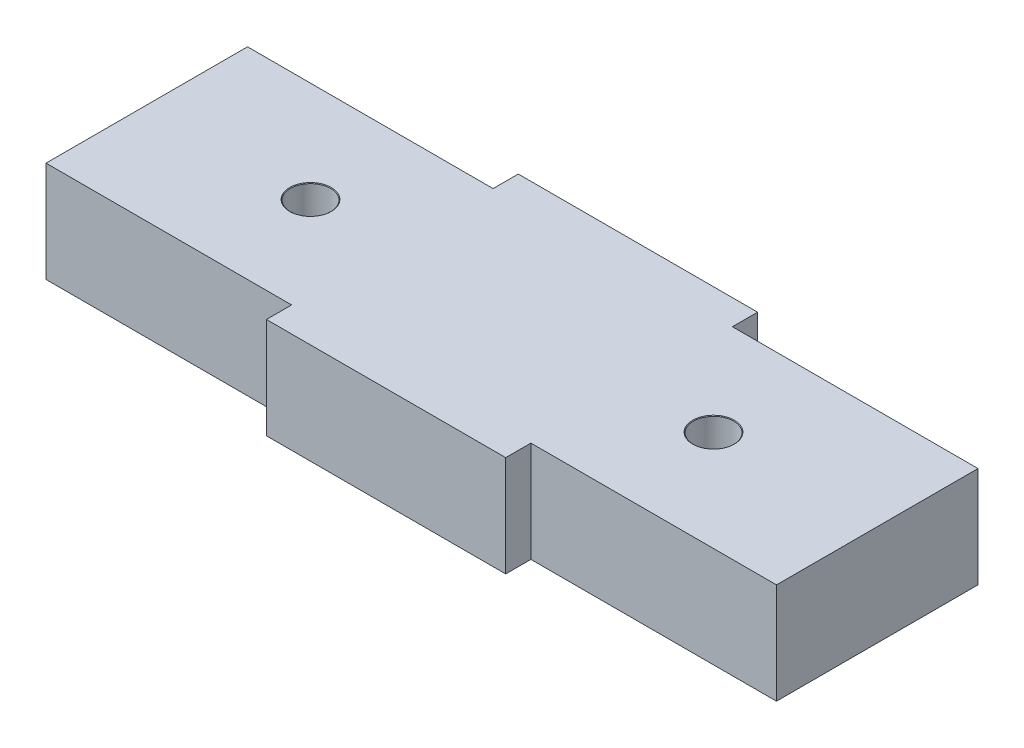
ISO-10303-21;
HEADER;
FILE_DESCRIPTION(('STEP AP214'),'2;1');
FILE_NAME('part.step','',(''),(''),'','','');
FILE_SCHEMA(('AUTOMOTIVE_DESIGN { 1 0 10303 214 1 1 1 1 }'));
ENDSEC;
DATA;
#1=APPLICATION_CONTEXT('core data for automotive mechanical design processes');
#2=APPLICATION_PROTOCOL_DEFINITION('international standard','automotive_design',2000,#1);
#3=PRODUCT_CONTEXT('',#1,'mechanical');
#4=PRODUCT('Part','Part','',(#3));
#5=PRODUCT_RELATED_PRODUCT_CATEGORY('part','',(#4));
#6=PRODUCT_DEFINITION_FORMATION('','',#4);
#7=PRODUCT_DEFINITION_CONTEXT('part definition',#1,'design');
#8=PRODUCT_DEFINITION('design','',#6,#7);
#9=PRODUCT_DEFINITION_SHAPE('','',#8);
#10=(LENGTH_UNIT() NAMED_UNIT(*) SI_UNIT(.MILLI.,.METRE.));
#11=(NAMED_UNIT(*) PLANE_ANGLE_UNIT() SI_UNIT($,.RADIAN.));
#12=(NAMED_UNIT(*) SI_UNIT($,.STERADIAN.) SOLID_ANGLE_UNIT());
#13=UNCERTAINTY_MEASURE_WITH_UNIT(LENGTH_MEASURE(1.E-05),#10,'distance_accuracy_value','');
#14=(GEOMETRIC_REPRESENTATION_CONTEXT(3) GLOBAL_UNCERTAINTY_ASSIGNED_CONTEXT((#13)) GLOBAL_UNIT_ASSIGNED_CONTEXT((#10,
#11,#12)) REPRESENTATION_CONTEXT('',''));
#15=CARTESIAN_POINT('',(0.,0.,0.));
#16=DIRECTION('',(0.,0.,1.));
#17=DIRECTION('',(1.,0.,0.));
#18=AXIS2_PLACEMENT_3D('',#15,#16,#17);
#19=CARTESIAN_POINT('',(0.,0.,0.));
#20=DIRECTION('',(0.,-1.,0.));
#21=DIRECTION('',(0.,0.,-1.));
#22=AXIS2_PLACEMENT_3D('',#19,#20,#21);
#23=PLANE('',#22);
#24=CARTESIAN_POINT('',(6.5,0.,-4.));
#25=DIRECTION('',(0.,1.,0.));
#26=DIRECTION('',(0.,0.,1.));
#27=AXIS2_PLACEMENT_3D('',#24,#25,#26);
#28=CIRCLE('',#27,0.799999999999999);
#29=CARTESIAN_POINT('',(6.5,0.,-3.2));
#30=VERTEX_POINT('',#29);
#31=EDGE_CURVE('E278',#30,#30,#28,.T.);
#32=ORIENTED_EDGE('',*,*,#31,.T.);
#33=EDGE_LOOP('',(#32));
#34=FACE_BOUND('',#33,.T.);
#35=DIRECTION('',(0.,0.,1.));
#36=VECTOR('',#35,1.);
#37=CARTESIAN_POINT('',(0.,0.,0.));
#38=LINE('',#37,#36);
#39=CARTESIAN_POINT('',(0.,0.,-8.));
#40=VERTEX_POINT('',#39);
#41=CARTESIAN_POINT('',(0.,0.,0.));
#42=VERTEX_POINT('',#41);
#43=EDGE_CURVE('E199',#40,#42,#38,.T.);
#44=ORIENTED_EDGE('',*,*,#43,.F.);
#45=DIRECTION('',(-1.,0.,0.));
#46=VECTOR('',#45,1.);
#47=CARTESIAN_POINT('',(0.,0.,-8.));
#48=LINE('',#47,#46);
#49=CARTESIAN_POINT('',(9.74999999999999,0.,-8.));
#50=VERTEX_POINT('',#49);
#51=EDGE_CURVE('E228',#50,#40,#48,.T.);
#52=ORIENTED_EDGE('',*,*,#51,.F.);
#53=DIRECTION('',(0.,0.,1.));
#54=VECTOR('',#53,1.);
#55=CARTESIAN_POINT('',(9.75,0.,-9.));
#56=LINE('',#55,#54);
#57=CARTESIAN_POINT('',(9.75,0.,-9.));
#58=VERTEX_POINT('',#57);
#59=EDGE_CURVE('E138',#58,#50,#56,.T.);
#60=ORIENTED_EDGE('',*,*,#59,.F.);
#61=DIRECTION('',(-1.,0.,0.));
#62=VECTOR('',#61,1.);
#63=CARTESIAN_POINT('',(19.25,0.,-9.));
#64=LINE('',#63,#62);
#65=CARTESIAN_POINT('',(19.25,0.,-9.));
#66=VERTEX_POINT('',#65);
#67=EDGE_CURVE('E130',#66,#58,#64,.T.);
#68=ORIENTED_EDGE('',*,*,#67,.F.);
#69=DIRECTION('',(0.,0.,1.));
#70=VECTOR('',#69,1.);
#71=CARTESIAN_POINT('',(19.25,0.,-9.));
#72=LINE('',#71,#70);
#73=CARTESIAN_POINT('',(19.25,0.,-8.));
#74=VERTEX_POINT('',#73);
#75=EDGE_CURVE('E136',#66,#74,#72,.T.);
#76=ORIENTED_EDGE('',*,*,#75,.T.);
#77=CARTESIAN_POINT('',(29.,0.,-8.));
#78=VERTEX_POINT('',#77);
#79=EDGE_CURVE('E205',#78,#74,#48,.T.);
#80=ORIENTED_EDGE('',*,*,#79,.F.);
#81=DIRECTION('',(0.,0.,-1.));
#82=VECTOR('',#81,1.);
#83=CARTESIAN_POINT('',(29.,0.,0.));
#84=LINE('',#83,#82);
#85=CARTESIAN_POINT('',(29.,0.,0.));
#86=VERTEX_POINT('',#85);
#87=EDGE_CURVE('E225',#86,#78,#84,.T.);
#88=ORIENTED_EDGE('',*,*,#87,.F.);
#89=DIRECTION('',(1.,0.,0.));
#90=VECTOR('',#89,1.);
#91=CARTESIAN_POINT('',(0.,0.,0.));
#92=LINE('',#91,#90);
#93=CARTESIAN_POINT('',(19.25,0.,0.));
#94=VERTEX_POINT('',#93);
#95=EDGE_CURVE('E221',#94,#86,#92,.T.);
#96=ORIENTED_EDGE('',*,*,#95,.F.);
#97=DIRECTION('',(0.,0.,-1.));
#98=VECTOR('',#97,1.);
#99=CARTESIAN_POINT('',(19.25,0.,1.));
#100=LINE('',#99,#98);
#101=CARTESIAN_POINT('',(19.25,0.,1.));
#102=VERTEX_POINT('',#101);
#103=EDGE_CURVE('E191',#102,#94,#100,.T.);
#104=ORIENTED_EDGE('',*,*,#103,.F.);
#105=DIRECTION('',(1.,0.,0.));
#106=VECTOR('',#105,1.);
#107=CARTESIAN_POINT('',(9.75,0.,1.));
#108=LINE('',#107,#106);
#109=CARTESIAN_POINT('',(9.75,0.,1.));
#110=VERTEX_POINT('',#109);
#111=EDGE_CURVE('E171',#110,#102,#108,.T.);
#112=ORIENTED_EDGE('',*,*,#111,.F.);
#113=DIRECTION('',(0.,0.,-1.));
#114=VECTOR('',#113,1.);
#115=CARTESIAN_POINT('',(9.75,0.,1.));
#116=LINE('',#115,#114);
#117=CARTESIAN_POINT('',(9.75,0.,0.));
#118=VERTEX_POINT('',#117);
#119=EDGE_CURVE('E195',#110,#118,#116,.T.);
#120=ORIENTED_EDGE('',*,*,#119,.T.);
#121=EDGE_CURVE('E222',#42,#118,#92,.T.);
#122=ORIENTED_EDGE('',*,*,#121,.F.);
#123=EDGE_LOOP('',(#44,#52,#60,#68,#76,#80,#88,#96,#104,#112,#120,#122));
#124=FACE_BOUND('',#123,.T.);
#125=CARTESIAN_POINT('',(22.5,0.,-4.));
#126=DIRECTION('',(0.,1.,0.));
#127=DIRECTION('',(0.,0.,1.));
#128=AXIS2_PLACEMENT_3D('',#125,#126,#127);
#129=CIRCLE('',#128,0.799999999999999);
#130=CARTESIAN_POINT('',(22.5,0.,-3.2));
#131=VERTEX_POINT('',#130);
#132=EDGE_CURVE('E263',#131,#131,#129,.T.);
#133=ORIENTED_EDGE('',*,*,#132,.T.);
#134=EDGE_LOOP('',(#133));
#135=FACE_BOUND('',#134,.T.);
#136=ADVANCED_FACE('F39',(#34,#124,#135),#23,.T.);
#137=CARTESIAN_POINT('',(0.,4.,0.));
#138=DIRECTION('',(0.,-1.,0.));
#139=DIRECTION('',(0.,0.,-1.));
#140=AXIS2_PLACEMENT_3D('',#137,#138,#139);
#141=PLANE('',#140);
#142=CARTESIAN_POINT('',(6.5,4.,-4.));
#143=DIRECTION('',(0.,1.,0.));
#144=DIRECTION('',(0.,0.,1.));
#145=AXIS2_PLACEMENT_3D('',#142,#143,#144);
#146=CIRCLE('',#145,0.825);
#147=CARTESIAN_POINT('',(6.5,4.,-3.175));
#148=VERTEX_POINT('',#147);
#149=EDGE_CURVE('E286',#148,#148,#146,.T.);
#150=ORIENTED_EDGE('',*,*,#149,.F.);
#151=EDGE_LOOP('',(#150));
#152=FACE_BOUND('',#151,.T.);
#153=DIRECTION('',(0.,0.,1.));
#154=VECTOR('',#153,1.);
#155=CARTESIAN_POINT('',(0.,4.,0.));
#156=LINE('',#155,#154);
#157=CARTESIAN_POINT('',(0.,4.,-8.));
#158=VERTEX_POINT('',#157);
#159=CARTESIAN_POINT('',(0.,4.,0.));
#160=VERTEX_POINT('',#159);
#161=EDGE_CURVE('E200',#158,#160,#156,.T.);
#162=ORIENTED_EDGE('',*,*,#161,.T.);
#163=DIRECTION('',(1.,0.,0.));
#164=VECTOR('',#163,1.);
#165=CARTESIAN_POINT('',(0.,4.,0.));
#166=LINE('',#165,#164);
#167=CARTESIAN_POINT('',(9.75,4.,0.));
#168=VERTEX_POINT('',#167);
#169=EDGE_CURVE('E206',#160,#168,#166,.T.);
#170=ORIENTED_EDGE('',*,*,#169,.T.);
#171=DIRECTION('',(0.,0.,-1.));
#172=VECTOR('',#171,1.);
#173=CARTESIAN_POINT('',(9.75,4.,1.));
#174=LINE('',#173,#172);
#175=CARTESIAN_POINT('',(9.75,4.,1.));
#176=VERTEX_POINT('',#175);
#177=EDGE_CURVE('E179',#176,#168,#174,.T.);
#178=ORIENTED_EDGE('',*,*,#177,.F.);
#179=DIRECTION('',(-1.,0.,0.));
#180=VECTOR('',#179,1.);
#181=CARTESIAN_POINT('',(9.75,4.,1.));
#182=LINE('',#181,#180);
#183=CARTESIAN_POINT('',(19.25,4.,1.));
#184=VERTEX_POINT('',#183);
#185=EDGE_CURVE('E177',#184,#176,#182,.T.);
#186=ORIENTED_EDGE('',*,*,#185,.F.);
#187=DIRECTION('',(0.,0.,-1.));
#188=VECTOR('',#187,1.);
#189=CARTESIAN_POINT('',(19.25,4.,1.));
#190=LINE('',#189,#188);
#191=CARTESIAN_POINT('',(19.25,4.,0.));
#192=VERTEX_POINT('',#191);
#193=EDGE_CURVE('E187',#184,#192,#190,.T.);
#194=ORIENTED_EDGE('',*,*,#193,.T.);
#195=CARTESIAN_POINT('',(29.,4.,0.));
#196=VERTEX_POINT('',#195);
#197=EDGE_CURVE('E204',#192,#196,#166,.T.);
#198=ORIENTED_EDGE('',*,*,#197,.T.);
#199=DIRECTION('',(0.,0.,-1.));
#200=VECTOR('',#199,1.);
#201=CARTESIAN_POINT('',(29.,4.,0.));
#202=LINE('',#201,#200);
#203=CARTESIAN_POINT('',(29.,4.,-8.));
#204=VERTEX_POINT('',#203);
#205=EDGE_CURVE('E210',#196,#204,#202,.T.);
#206=ORIENTED_EDGE('',*,*,#205,.T.);
#207=DIRECTION('',(-1.,0.,0.));
#208=VECTOR('',#207,1.);
#209=CARTESIAN_POINT('',(0.,4.,-8.));
#210=LINE('',#209,#208);
#211=CARTESIAN_POINT('',(19.25,4.,-8.));
#212=VERTEX_POINT('',#211);
#213=EDGE_CURVE('E214',#204,#212,#210,.T.);
#214=ORIENTED_EDGE('',*,*,#213,.T.);
#215=DIRECTION('',(0.,0.,1.));
#216=VECTOR('',#215,1.);
#217=CARTESIAN_POINT('',(19.25,4.,-9.));
#218=LINE('',#217,#216);
#219=CARTESIAN_POINT('',(19.25,4.,-9.));
#220=VERTEX_POINT('',#219);
#221=EDGE_CURVE('E252',#220,#212,#218,.T.);
#222=ORIENTED_EDGE('',*,*,#221,.F.);
#223=DIRECTION('',(1.,0.,0.));
#224=VECTOR('',#223,1.);
#225=CARTESIAN_POINT('',(19.25,4.,-9.));
#226=LINE('',#225,#224);
#227=CARTESIAN_POINT('',(9.75,4.,-9.));
#228=VERTEX_POINT('',#227);
#229=EDGE_CURVE('E148',#228,#220,#226,.T.);
#230=ORIENTED_EDGE('',*,*,#229,.F.);
#231=DIRECTION('',(0.,0.,1.));
#232=VECTOR('',#231,1.);
#233=CARTESIAN_POINT('',(9.75,4.,-9.));
#234=LINE('',#233,#232);
#235=CARTESIAN_POINT('',(9.75,4.,-8.));
#236=VERTEX_POINT('',#235);
#237=EDGE_CURVE('E163',#228,#236,#234,.T.);
#238=ORIENTED_EDGE('',*,*,#237,.T.);
#239=EDGE_CURVE('E213',#236,#158,#210,.T.);
#240=ORIENTED_EDGE('',*,*,#239,.T.);
#241=EDGE_LOOP('',(#162,#170,#178,#186,#194,#198,#206,#214,#222,#230,#238,#240));
#242=FACE_BOUND('',#241,.T.);
#243=CARTESIAN_POINT('',(22.5,4.,-4.));
#244=DIRECTION('',(0.,1.,0.));
#245=DIRECTION('',(0.,0.,1.));
#246=AXIS2_PLACEMENT_3D('',#243,#244,#245);
#247=CIRCLE('',#246,0.824999999999999);
#248=CARTESIAN_POINT('',(22.5,4.,-3.175));
#249=VERTEX_POINT('',#248);
#250=EDGE_CURVE('E274',#249,#249,#247,.T.);
#251=ORIENTED_EDGE('',*,*,#250,.F.);
#252=EDGE_LOOP('',(#251));
#253=FACE_BOUND('',#252,.T.);
#254=ADVANCED_FACE('F250',(#152,#242,#253),#141,.F.);
#255=CARTESIAN_POINT('',(0.,4.,-8.));
#256=DIRECTION('',(0.,0.,1.));
#257=DIRECTION('',(1.,0.,0.));
#258=AXIS2_PLACEMENT_3D('',#255,#256,#257);
#259=PLANE('',#258);
#260=DIRECTION('',(0.,-1.,0.));
#261=VECTOR('',#260,1.);
#262=CARTESIAN_POINT('',(19.25,0.,-8.));
#263=LINE('',#262,#261);
#264=EDGE_CURVE('E55',#212,#74,#263,.T.);
#265=ORIENTED_EDGE('',*,*,#264,.F.);
#266=ORIENTED_EDGE('',*,*,#213,.F.);
#267=DIRECTION('',(0.,-1.,0.));
#268=VECTOR('',#267,1.);
#269=CARTESIAN_POINT('',(29.,4.,-8.));
#270=LINE('',#269,#268);
#271=EDGE_CURVE('E234',#204,#78,#270,.T.);
#272=ORIENTED_EDGE('',*,*,#271,.T.);
#273=ORIENTED_EDGE('',*,*,#79,.T.);
#274=EDGE_LOOP('',(#265,#266,#272,#273));
#275=FACE_BOUND('',#274,.T.);
#276=ADVANCED_FACE('F248',(#275),#259,.F.);
#277=DIRECTION('',(0.,1.,0.));
#278=VECTOR('',#277,1.);
#279=CARTESIAN_POINT('',(9.75,0.,-8.));
#280=LINE('',#279,#278);
#281=EDGE_CURVE('E63',#50,#236,#280,.T.);
#282=ORIENTED_EDGE('',*,*,#281,.F.);
#283=ORIENTED_EDGE('',*,*,#51,.T.);
#284=DIRECTION('',(0.,-1.,0.));
#285=VECTOR('',#284,1.);
#286=CARTESIAN_POINT('',(0.,4.,-8.));
#287=LINE('',#286,#285);
#288=EDGE_CURVE('E217',#158,#40,#287,.T.);
#289=ORIENTED_EDGE('',*,*,#288,.F.);
#290=ORIENTED_EDGE('',*,*,#239,.F.);
#291=EDGE_LOOP('',(#282,#283,#289,#290));
#292=FACE_BOUND('',#291,.T.);
#293=ADVANCED_FACE('F299',(#292),#259,.F.);
#294=CARTESIAN_POINT('',(0.,4.,0.));
#295=DIRECTION('',(0.,0.,-1.));
#296=DIRECTION('',(-1.,0.,0.));
#297=AXIS2_PLACEMENT_3D('',#294,#295,#296);
#298=PLANE('',#297);
#299=DIRECTION('',(0.,-1.,0.));
#300=VECTOR('',#299,1.);
#301=CARTESIAN_POINT('',(9.75,0.,0.));
#302=LINE('',#301,#300);
#303=EDGE_CURVE('E156',#168,#118,#302,.T.);
#304=ORIENTED_EDGE('',*,*,#303,.F.);
#305=ORIENTED_EDGE('',*,*,#169,.F.);
#306=DIRECTION('',(0.,-1.,0.));
#307=VECTOR('',#306,1.);
#308=CARTESIAN_POINT('',(0.,4.,0.));
#309=LINE('',#308,#307);
#310=EDGE_CURVE('E11',#160,#42,#309,.T.);
#311=ORIENTED_EDGE('',*,*,#310,.T.);
#312=ORIENTED_EDGE('',*,*,#121,.T.);
#313=EDGE_LOOP('',(#304,#305,#311,#312));
#314=FACE_BOUND('',#313,.T.);
#315=ADVANCED_FACE('F308',(#314),#298,.F.);
#316=DIRECTION('',(0.,1.,0.));
#317=VECTOR('',#316,1.);
#318=CARTESIAN_POINT('',(19.25,0.,0.));
#319=LINE('',#318,#317);
#320=EDGE_CURVE('E161',#94,#192,#319,.T.);
#321=ORIENTED_EDGE('',*,*,#320,.F.);
#322=ORIENTED_EDGE('',*,*,#95,.T.);
#323=DIRECTION('',(0.,-1.,0.));
#324=VECTOR('',#323,1.);
#325=CARTESIAN_POINT('',(29.,4.,0.));
#326=LINE('',#325,#324);
#327=EDGE_CURVE('E48',#196,#86,#326,.T.);
#328=ORIENTED_EDGE('',*,*,#327,.F.);
#329=ORIENTED_EDGE('',*,*,#197,.F.);
#330=EDGE_LOOP('',(#321,#322,#328,#329));
#331=FACE_BOUND('',#330,.T.);
#332=ADVANCED_FACE('F310',(#331),#298,.F.);
#333=CARTESIAN_POINT('',(0.,4.,0.));
#334=DIRECTION('',(1.,0.,0.));
#335=DIRECTION('',(0.,0.,-1.));
#336=AXIS2_PLACEMENT_3D('',#333,#334,#335);
#337=PLANE('',#336);
#338=ORIENTED_EDGE('',*,*,#43,.T.);
#339=ORIENTED_EDGE('',*,*,#310,.F.);
#340=ORIENTED_EDGE('',*,*,#161,.F.);
#341=ORIENTED_EDGE('',*,*,#288,.T.);
#342=EDGE_LOOP('',(#338,#339,#340,#341));
#343=FACE_BOUND('',#342,.T.);
#344=ADVANCED_FACE('F41',(#343),#337,.F.);
#345=CARTESIAN_POINT('',(29.,4.,0.));
#346=DIRECTION('',(-1.,0.,0.));
#347=DIRECTION('',(0.,0.,1.));
#348=AXIS2_PLACEMENT_3D('',#345,#346,#347);
#349=PLANE('',#348);
#350=ORIENTED_EDGE('',*,*,#87,.T.);
#351=ORIENTED_EDGE('',*,*,#271,.F.);
#352=ORIENTED_EDGE('',*,*,#205,.F.);
#353=ORIENTED_EDGE('',*,*,#327,.T.);
#354=EDGE_LOOP('',(#350,#351,#352,#353));
#355=FACE_BOUND('',#354,.T.);
#356=ADVANCED_FACE('F243',(#355),#349,.F.);
#357=CARTESIAN_POINT('',(9.75,0.,1.));
#358=DIRECTION('',(1.,0.,0.));
#359=DIRECTION('',(0.,0.,-1.));
#360=AXIS2_PLACEMENT_3D('',#357,#358,#359);
#361=PLANE('',#360);
#362=ORIENTED_EDGE('',*,*,#303,.T.);
#363=ORIENTED_EDGE('',*,*,#119,.F.);
#364=DIRECTION('',(0.,-1.,0.));
#365=VECTOR('',#364,1.);
#366=CARTESIAN_POINT('',(9.75,0.,1.));
#367=LINE('',#366,#365);
#368=EDGE_CURVE('E167',#176,#110,#367,.T.);
#369=ORIENTED_EDGE('',*,*,#368,.F.);
#370=ORIENTED_EDGE('',*,*,#177,.T.);
#371=EDGE_LOOP('',(#362,#363,#369,#370));
#372=FACE_BOUND('',#371,.T.);
#373=ADVANCED_FACE('F304',(#372),#361,.F.);
#374=CARTESIAN_POINT('',(19.25,0.,1.));
#375=DIRECTION('',(-1.,0.,0.));
#376=DIRECTION('',(0.,0.,1.));
#377=AXIS2_PLACEMENT_3D('',#374,#375,#376);
#378=PLANE('',#377);
#379=ORIENTED_EDGE('',*,*,#320,.T.);
#380=ORIENTED_EDGE('',*,*,#193,.F.);
#381=DIRECTION('',(0.,1.,0.));
#382=VECTOR('',#381,1.);
#383=CARTESIAN_POINT('',(19.25,0.,1.));
#384=LINE('',#383,#382);
#385=EDGE_CURVE('E174',#102,#184,#384,.T.);
#386=ORIENTED_EDGE('',*,*,#385,.F.);
#387=ORIENTED_EDGE('',*,*,#103,.T.);
#388=EDGE_LOOP('',(#379,#380,#386,#387));
#389=FACE_BOUND('',#388,.T.);
#390=ADVANCED_FACE('F328',(#389),#378,.F.);
#391=CARTESIAN_POINT('',(0.,0.,1.));
#392=DIRECTION('',(0.,0.,-1.));
#393=DIRECTION('',(-1.,0.,0.));
#394=AXIS2_PLACEMENT_3D('',#391,#392,#393);
#395=PLANE('',#394);
#396=ORIENTED_EDGE('',*,*,#368,.T.);
#397=ORIENTED_EDGE('',*,*,#111,.T.);
#398=ORIENTED_EDGE('',*,*,#385,.T.);
#399=ORIENTED_EDGE('',*,*,#185,.T.);
#400=EDGE_LOOP('',(#396,#397,#398,#399));
#401=FACE_BOUND('',#400,.T.);
#402=ADVANCED_FACE('F324',(#401),#395,.F.);
#403=CARTESIAN_POINT('',(19.25,0.,-9.));
#404=DIRECTION('',(-1.,0.,0.));
#405=DIRECTION('',(0.,0.,1.));
#406=AXIS2_PLACEMENT_3D('',#403,#404,#405);
#407=PLANE('',#406);
#408=ORIENTED_EDGE('',*,*,#264,.T.);
#409=ORIENTED_EDGE('',*,*,#75,.F.);
#410=DIRECTION('',(0.,-1.,0.));
#411=VECTOR('',#410,1.);
#412=CARTESIAN_POINT('',(19.25,0.,-9.));
#413=LINE('',#412,#411);
#414=EDGE_CURVE('E143',#220,#66,#413,.T.);
#415=ORIENTED_EDGE('',*,*,#414,.F.);
#416=ORIENTED_EDGE('',*,*,#221,.T.);
#417=EDGE_LOOP('',(#408,#409,#415,#416));
#418=FACE_BOUND('',#417,.T.);
#419=ADVANCED_FACE('F154',(#418),#407,.F.);
#420=CARTESIAN_POINT('',(9.75,0.,-9.));
#421=DIRECTION('',(1.,0.,0.));
#422=DIRECTION('',(0.,1.,0.));
#423=AXIS2_PLACEMENT_3D('',#420,#421,#422);
#424=PLANE('',#423);
#425=ORIENTED_EDGE('',*,*,#281,.T.);
#426=ORIENTED_EDGE('',*,*,#237,.F.);
#427=DIRECTION('',(0.,1.,0.));
#428=VECTOR('',#427,1.);
#429=CARTESIAN_POINT('',(9.75,0.,-9.));
#430=LINE('',#429,#428);
#431=EDGE_CURVE('E142',#58,#228,#430,.T.);
#432=ORIENTED_EDGE('',*,*,#431,.F.);
#433=ORIENTED_EDGE('',*,*,#59,.T.);
#434=EDGE_LOOP('',(#425,#426,#432,#433));
#435=FACE_BOUND('',#434,.T.);
#436=ADVANCED_FACE('F366',(#435),#424,.F.);
#437=CARTESIAN_POINT('',(0.,0.,-9.));
#438=DIRECTION('',(0.,0.,1.));
#439=DIRECTION('',(1.,0.,0.));
#440=AXIS2_PLACEMENT_3D('',#437,#438,#439);
#441=PLANE('',#440);
#442=ORIENTED_EDGE('',*,*,#414,.T.);
#443=ORIENTED_EDGE('',*,*,#67,.T.);
#444=ORIENTED_EDGE('',*,*,#431,.T.);
#445=ORIENTED_EDGE('',*,*,#229,.T.);
#446=EDGE_LOOP('',(#442,#443,#444,#445));
#447=FACE_BOUND('',#446,.T.);
#448=ADVANCED_FACE('F146',(#447),#441,.F.);
#449=CARTESIAN_POINT('',(22.5,4.,-4.));
#450=DIRECTION('',(0.,1.,0.));
#451=DIRECTION('',(0.,0.,1.));
#452=AXIS2_PLACEMENT_3D('',#449,#450,#451);
#453=CYLINDRICAL_SURFACE('',#452,0.799999999999999);
#454=ORIENTED_EDGE('',*,*,#132,.F.);
#455=EDGE_LOOP('',(#454));
#456=FACE_BOUND('',#455,.T.);
#457=CARTESIAN_POINT('',(22.5,3.97902250922057,-4.));
#458=DIRECTION('',(0.,1.,0.));
#459=DIRECTION('',(0.,0.,1.));
#460=AXIS2_PLACEMENT_3D('',#457,#458,#459);
#461=CIRCLE('',#460,0.799999999999999);
#462=CARTESIAN_POINT('',(22.5,3.97902250922057,-3.2));
#463=VERTEX_POINT('',#462);
#464=EDGE_CURVE('E270',#463,#463,#461,.T.);
#465=ORIENTED_EDGE('',*,*,#464,.T.);
#466=EDGE_LOOP('',(#465));
#467=FACE_BOUND('',#466,.T.);
#468=ADVANCED_FACE('F381',(#456,#467),#453,.F.);
#469=CARTESIAN_POINT('',(22.5,4.,-4.));
#470=DIRECTION('',(0.,1.,0.));
#471=DIRECTION('',(0.,0.,1.));
#472=AXIS2_PLACEMENT_3D('',#469,#470,#471);
#473=CONICAL_SURFACE('',#472,0.824999999999999,0.872664625997179);
#474=ORIENTED_EDGE('',*,*,#464,.F.);
#475=EDGE_LOOP('',(#474));
#476=FACE_BOUND('',#475,.T.);
#477=ORIENTED_EDGE('',*,*,#250,.T.);
#478=EDGE_LOOP('',(#477));
#479=FACE_BOUND('',#478,.T.);
#480=ADVANCED_FACE('F389',(#476,#479),#473,.F.);
#481=CARTESIAN_POINT('',(6.5,4.,-4.));
#482=DIRECTION('',(0.,1.,0.));
#483=DIRECTION('',(0.,0.,1.));
#484=AXIS2_PLACEMENT_3D('',#481,#482,#483);
#485=CYLINDRICAL_SURFACE('',#484,0.799999999999999);
#486=ORIENTED_EDGE('',*,*,#31,.F.);
#487=EDGE_LOOP('',(#486));
#488=FACE_BOUND('',#487,.T.);
#489=CARTESIAN_POINT('',(6.5,3.97902250922057,-4.));
#490=DIRECTION('',(0.,1.,0.));
#491=DIRECTION('',(0.,0.,1.));
#492=AXIS2_PLACEMENT_3D('',#489,#490,#491);
#493=CIRCLE('',#492,0.799999999999999);
#494=CARTESIAN_POINT('',(6.5,3.97902250922057,-3.2));
#495=VERTEX_POINT('',#494);
#496=EDGE_CURVE('E282',#495,#495,#493,.T.);
#497=ORIENTED_EDGE('',*,*,#496,.T.);
#498=EDGE_LOOP('',(#497));
#499=FACE_BOUND('',#498,.T.);
#500=ADVANCED_FACE('F397',(#488,#499),#485,.F.);
#501=CARTESIAN_POINT('',(6.5,4.,-4.));
#502=DIRECTION('',(0.,1.,0.));
#503=DIRECTION('',(0.,0.,1.));
#504=AXIS2_PLACEMENT_3D('',#501,#502,#503);
#505=CONICAL_SURFACE('',#504,0.825,0.872664625997179);
#506=ORIENTED_EDGE('',*,*,#496,.F.);
#507=EDGE_LOOP('',(#506));
#508=FACE_BOUND('',#507,.T.);
#509=ORIENTED_EDGE('',*,*,#149,.T.);
#510=EDGE_LOOP('',(#509));
#511=FACE_BOUND('',#510,.T.);
#512=ADVANCED_FACE('F291',(#508,#511),#505,.F.);
#513=CLOSED_SHELL('',(#136,#254,#276,#293,#315,#332,#344,#356,#373,#390,#402,#419,#436,#448,
#468,#480,#500,#512));
#514=MANIFOLD_SOLID_BREP('B2',#513);
#515=ADVANCED_BREP_SHAPE_REPRESENTATION('',(#18,#514),#14);
#516=SHAPE_DEFINITION_REPRESENTATION(#9,#515);
ENDSEC;
END-ISO-10303-21;
